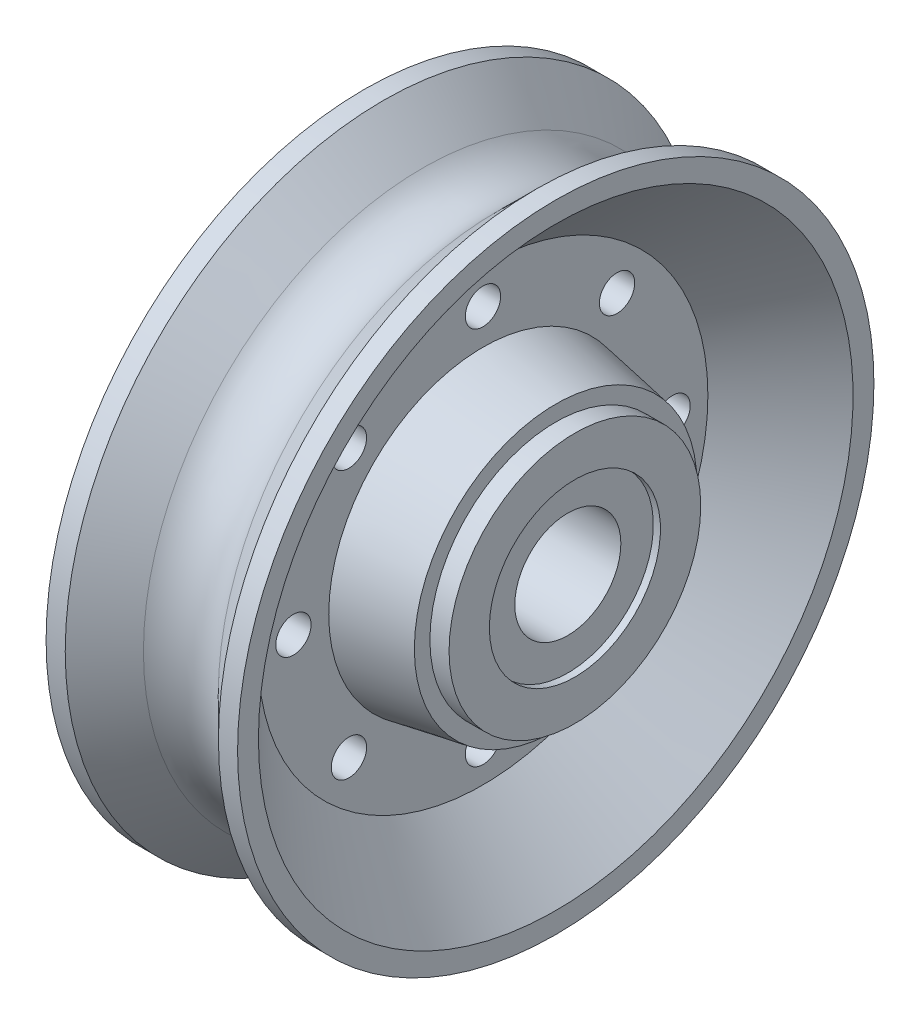
ISO-10303-21;
HEADER;
FILE_DESCRIPTION(('STEP AP214'),'2;1');
FILE_NAME('part.step','',(''),(''),'','','');
FILE_SCHEMA(('AUTOMOTIVE_DESIGN { 1 0 10303 214 1 1 1 1 }'));
ENDSEC;
DATA;
#1=APPLICATION_CONTEXT('core data for automotive mechanical design processes');
#2=APPLICATION_PROTOCOL_DEFINITION('international standard','automotive_design',2000,#1);
#3=PRODUCT_CONTEXT('',#1,'mechanical');
#4=PRODUCT('Part','Part','',(#3));
#5=PRODUCT_RELATED_PRODUCT_CATEGORY('part','',(#4));
#6=PRODUCT_DEFINITION_FORMATION('','',#4);
#7=PRODUCT_DEFINITION_CONTEXT('part definition',#1,'design');
#8=PRODUCT_DEFINITION('design','',#6,#7);
#9=PRODUCT_DEFINITION_SHAPE('','',#8);
#10=(LENGTH_UNIT() NAMED_UNIT(*) SI_UNIT(.MILLI.,.METRE.));
#11=(NAMED_UNIT(*) PLANE_ANGLE_UNIT() SI_UNIT($,.RADIAN.));
#12=(NAMED_UNIT(*) SI_UNIT($,.STERADIAN.) SOLID_ANGLE_UNIT());
#13=UNCERTAINTY_MEASURE_WITH_UNIT(LENGTH_MEASURE(1.E-05),#10,'distance_accuracy_value','');
#14=(GEOMETRIC_REPRESENTATION_CONTEXT(3) GLOBAL_UNCERTAINTY_ASSIGNED_CONTEXT((#13)) GLOBAL_UNIT_ASSIGNED_CONTEXT((#10,
#11,#12)) REPRESENTATION_CONTEXT('',''));
#15=CARTESIAN_POINT('',(0.,0.,0.));
#16=DIRECTION('',(0.,0.,1.));
#17=DIRECTION('',(1.,0.,0.));
#18=AXIS2_PLACEMENT_3D('',#15,#16,#17);
#19=CARTESIAN_POINT('',(-10.31875,0.,0.));
#20=DIRECTION('',(-1.,0.,0.));
#21=DIRECTION('',(0.,0.,1.));
#22=AXIS2_PLACEMENT_3D('',#19,#20,#21);
#23=CYLINDRICAL_SURFACE('',#22,4.7625);
#24=CARTESIAN_POINT('',(-9.68375,0.,0.));
#25=DIRECTION('',(-1.,0.,0.));
#26=DIRECTION('',(0.,0.,1.));
#27=AXIS2_PLACEMENT_3D('',#24,#25,#26);
#28=CIRCLE('',#27,4.7625);
#29=CARTESIAN_POINT('',(-9.68375,0.,4.7625));
#30=VERTEX_POINT('',#29);
#31=EDGE_CURVE('E91',#30,#30,#28,.F.);
#32=ORIENTED_EDGE('',*,*,#31,.F.);
#33=EDGE_LOOP('',(#32));
#34=FACE_BOUND('',#33,.T.);
#35=CARTESIAN_POINT('',(9.68375,0.,0.));
#36=DIRECTION('',(1.,0.,0.));
#37=DIRECTION('',(0.,0.,-1.));
#38=AXIS2_PLACEMENT_3D('',#35,#36,#37);
#39=CIRCLE('',#38,4.7625);
#40=CARTESIAN_POINT('',(9.68375,0.,-4.7625));
#41=VERTEX_POINT('',#40);
#42=EDGE_CURVE('E36',#41,#41,#39,.F.);
#43=ORIENTED_EDGE('',*,*,#42,.F.);
#44=EDGE_LOOP('',(#43));
#45=FACE_BOUND('',#44,.T.);
#46=ADVANCED_FACE('F32',(#34,#45),#23,.F.);
#47=CARTESIAN_POINT('',(10.31875,12.7,0.));
#48=DIRECTION('',(-1.,0.,0.));
#49=DIRECTION('',(0.,0.,1.));
#50=AXIS2_PLACEMENT_3D('',#47,#48,#49);
#51=PLANE('',#50);
#52=CARTESIAN_POINT('',(10.31875,0.,0.));
#53=DIRECTION('',(-1.,0.,0.));
#54=DIRECTION('',(0.,0.,1.));
#55=AXIS2_PLACEMENT_3D('',#52,#53,#54);
#56=CIRCLE('',#55,11.303);
#57=CARTESIAN_POINT('',(10.31875,0.,11.303));
#58=VERTEX_POINT('',#57);
#59=EDGE_CURVE('E294',#58,#58,#56,.T.);
#60=ORIENTED_EDGE('',*,*,#59,.F.);
#61=EDGE_LOOP('',(#60));
#62=FACE_BOUND('',#61,.T.);
#63=CARTESIAN_POINT('',(10.31875,0.,0.));
#64=DIRECTION('',(-1.,0.,0.));
#65=DIRECTION('',(0.,0.,1.));
#66=AXIS2_PLACEMENT_3D('',#63,#64,#65);
#67=CIRCLE('',#66,7.6835);
#68=CARTESIAN_POINT('',(10.31875,0.,7.6835));
#69=VERTEX_POINT('',#68);
#70=EDGE_CURVE('E297',#69,#69,#67,.T.);
#71=ORIENTED_EDGE('',*,*,#70,.T.);
#72=EDGE_LOOP('',(#71));
#73=FACE_BOUND('',#72,.T.);
#74=ADVANCED_FACE('F167',(#62,#73),#51,.F.);
#75=CARTESIAN_POINT('',(-10.31875,4.7625,0.));
#76=DIRECTION('',(1.,0.,0.));
#77=DIRECTION('',(0.,0.,-1.));
#78=AXIS2_PLACEMENT_3D('',#75,#76,#77);
#79=PLANE('',#78);
#80=CARTESIAN_POINT('',(-10.31875,0.,0.));
#81=DIRECTION('',(-1.,0.,0.));
#82=DIRECTION('',(0.,0.,1.));
#83=AXIS2_PLACEMENT_3D('',#80,#81,#82);
#84=CIRCLE('',#83,7.6835);
#85=CARTESIAN_POINT('',(-10.31875,0.,7.6835));
#86=VERTEX_POINT('',#85);
#87=EDGE_CURVE('E101',#86,#86,#84,.T.);
#88=ORIENTED_EDGE('',*,*,#87,.F.);
#89=EDGE_LOOP('',(#88));
#90=FACE_BOUND('',#89,.T.);
#91=CARTESIAN_POINT('',(-10.31875,0.,0.));
#92=DIRECTION('',(-1.,0.,0.));
#93=DIRECTION('',(0.,0.,1.));
#94=AXIS2_PLACEMENT_3D('',#91,#92,#93);
#95=CIRCLE('',#94,11.303);
#96=CARTESIAN_POINT('',(-10.31875,0.,11.303));
#97=VERTEX_POINT('',#96);
#98=EDGE_CURVE('E93',#97,#97,#95,.T.);
#99=ORIENTED_EDGE('',*,*,#98,.T.);
#100=EDGE_LOOP('',(#99));
#101=FACE_BOUND('',#100,.T.);
#102=ADVANCED_FACE('F173',(#90,#101),#79,.F.);
#103=CARTESIAN_POINT('',(8.59895833333333,28.575,0.));
#104=DIRECTION('',(-1.,0.,0.));
#105=DIRECTION('',(0.,0.,1.));
#106=AXIS2_PLACEMENT_3D('',#103,#104,#105);
#107=PLANE('',#106);
#108=CARTESIAN_POINT('',(8.59895833333333,0.,0.));
#109=DIRECTION('',(-1.,0.,0.));
#110=DIRECTION('',(0.,0.,1.));
#111=AXIS2_PLACEMENT_3D('',#108,#109,#110);
#112=CIRCLE('',#111,28.575);
#113=CARTESIAN_POINT('',(8.59895833333333,0.,28.575));
#114=VERTEX_POINT('',#113);
#115=EDGE_CURVE('E145',#114,#114,#112,.T.);
#116=ORIENTED_EDGE('',*,*,#115,.F.);
#117=EDGE_LOOP('',(#116));
#118=FACE_BOUND('',#117,.T.);
#119=CARTESIAN_POINT('',(8.59895833333333,0.,0.));
#120=DIRECTION('',(-1.,0.,0.));
#121=DIRECTION('',(0.,0.,1.));
#122=AXIS2_PLACEMENT_3D('',#119,#120,#121);
#123=CIRCLE('',#122,26.70304692904);
#124=CARTESIAN_POINT('',(8.59895833333333,0.,26.70304692904));
#125=VERTEX_POINT('',#124);
#126=EDGE_CURVE('E54',#125,#125,#123,.F.);
#127=ORIENTED_EDGE('',*,*,#126,.F.);
#128=EDGE_LOOP('',(#127));
#129=FACE_BOUND('',#128,.T.);
#130=ADVANCED_FACE('F181',(#118,#129),#107,.F.);
#131=CARTESIAN_POINT('',(-8.59895833333333,12.7,0.));
#132=DIRECTION('',(1.,0.,0.));
#133=DIRECTION('',(0.,0.,-1.));
#134=AXIS2_PLACEMENT_3D('',#131,#132,#133);
#135=PLANE('',#134);
#136=CARTESIAN_POINT('',(-8.59895833333333,0.,0.));
#137=DIRECTION('',(-1.,0.,0.));
#138=DIRECTION('',(0.,0.,1.));
#139=AXIS2_PLACEMENT_3D('',#136,#137,#138);
#140=CIRCLE('',#139,28.575);
#141=CARTESIAN_POINT('',(-8.59895833333333,0.,28.575));
#142=VERTEX_POINT('',#141);
#143=EDGE_CURVE('E45',#142,#142,#140,.T.);
#144=ORIENTED_EDGE('',*,*,#143,.T.);
#145=EDGE_LOOP('',(#144));
#146=FACE_BOUND('',#145,.T.);
#147=CARTESIAN_POINT('',(-8.59895833333333,0.,0.));
#148=DIRECTION('',(1.,0.,0.));
#149=DIRECTION('',(0.,0.,-1.));
#150=AXIS2_PLACEMENT_3D('',#147,#148,#149);
#151=CIRCLE('',#150,26.70304692904);
#152=CARTESIAN_POINT('',(-8.59895833333333,0.,-26.70304692904));
#153=VERTEX_POINT('',#152);
#154=EDGE_CURVE('E49',#153,#153,#151,.F.);
#155=ORIENTED_EDGE('',*,*,#154,.F.);
#156=EDGE_LOOP('',(#155));
#157=FACE_BOUND('',#156,.T.);
#158=ADVANCED_FACE('F150',(#146,#157),#135,.F.);
#159=CARTESIAN_POINT('',(0.,0.,0.));
#160=DIRECTION('',(-1.,0.,0.));
#161=DIRECTION('',(0.,0.,1.));
#162=AXIS2_PLACEMENT_3D('',#159,#160,#161);
#163=TOROIDAL_SURFACE('',#162,28.448,4.76249999999999);
#164=CARTESIAN_POINT('',(-3.35943665925788,0.,0.));
#165=DIRECTION('',(-1.,0.,0.));
#166=DIRECTION('',(0.,0.,1.));
#167=AXIS2_PLACEMENT_3D('',#164,#165,#166);
#168=CIRCLE('',#167,25.0722642901977);
#169=CARTESIAN_POINT('',(-3.35943665925788,0.,25.0722642901977));
#170=VERTEX_POINT('',#169);
#171=EDGE_CURVE('E10',#170,#170,#168,.T.);
#172=ORIENTED_EDGE('',*,*,#171,.F.);
#173=EDGE_LOOP('',(#172));
#174=FACE_BOUND('',#173,.T.);
#175=CARTESIAN_POINT('',(3.35943665925788,0.,0.));
#176=DIRECTION('',(-1.,0.,0.));
#177=DIRECTION('',(0.,0.,1.));
#178=AXIS2_PLACEMENT_3D('',#175,#176,#177);
#179=CIRCLE('',#178,25.0722642901977);
#180=CARTESIAN_POINT('',(3.35943665925788,0.,25.0722642901977));
#181=VERTEX_POINT('',#180);
#182=EDGE_CURVE('E52',#181,#181,#179,.T.);
#183=ORIENTED_EDGE('',*,*,#182,.T.);
#184=EDGE_LOOP('',(#183));
#185=FACE_BOUND('',#184,.T.);
#186=ADVANCED_FACE('F34',(#174,#185),#163,.F.);
#187=CARTESIAN_POINT('',(-3.35943665925788,0.,0.));
#188=DIRECTION('',(-1.,0.,0.));
#189=DIRECTION('',(0.,0.,1.));
#190=AXIS2_PLACEMENT_3D('',#187,#188,#189);
#191=CONICAL_SURFACE('',#190,25.0722642901977,0.782978178008253);
#192=CARTESIAN_POINT('',(-6.87916666666667,0.,0.));
#193=DIRECTION('',(-1.,0.,0.));
#194=DIRECTION('',(0.,0.,1.));
#195=AXIS2_PLACEMENT_3D('',#192,#193,#194);
#196=CIRCLE('',#195,28.575);
#197=CARTESIAN_POINT('',(-6.87916666666667,0.,28.575));
#198=VERTEX_POINT('',#197);
#199=EDGE_CURVE('E40',#198,#198,#196,.T.);
#200=ORIENTED_EDGE('',*,*,#199,.F.);
#201=EDGE_LOOP('',(#200));
#202=FACE_BOUND('',#201,.T.);
#203=ORIENTED_EDGE('',*,*,#171,.T.);
#204=EDGE_LOOP('',(#203));
#205=FACE_BOUND('',#204,.T.);
#206=ADVANCED_FACE('F157',(#202,#205),#191,.T.);
#207=CARTESIAN_POINT('',(-10.31875,0.,0.));
#208=DIRECTION('',(-1.,0.,0.));
#209=DIRECTION('',(0.,0.,1.));
#210=AXIS2_PLACEMENT_3D('',#207,#208,#209);
#211=CYLINDRICAL_SURFACE('',#210,28.575);
#212=ORIENTED_EDGE('',*,*,#143,.F.);
#213=EDGE_LOOP('',(#212));
#214=FACE_BOUND('',#213,.T.);
#215=ORIENTED_EDGE('',*,*,#199,.T.);
#216=EDGE_LOOP('',(#215));
#217=FACE_BOUND('',#216,.T.);
#218=ADVANCED_FACE('F153',(#214,#217),#211,.T.);
#219=CARTESIAN_POINT('',(-10.31875,0.,0.));
#220=DIRECTION('',(-1.,0.,0.));
#221=DIRECTION('',(0.,0.,1.));
#222=AXIS2_PLACEMENT_3D('',#219,#220,#221);
#223=CYLINDRICAL_SURFACE('',#222,28.575);
#224=CARTESIAN_POINT('',(6.87916666666667,0.,0.));
#225=DIRECTION('',(-1.,0.,0.));
#226=DIRECTION('',(0.,0.,1.));
#227=AXIS2_PLACEMENT_3D('',#224,#225,#226);
#228=CIRCLE('',#227,28.575);
#229=CARTESIAN_POINT('',(6.87916666666667,0.,28.575));
#230=VERTEX_POINT('',#229);
#231=EDGE_CURVE('E142',#230,#230,#228,.T.);
#232=ORIENTED_EDGE('',*,*,#231,.F.);
#233=EDGE_LOOP('',(#232));
#234=FACE_BOUND('',#233,.T.);
#235=ORIENTED_EDGE('',*,*,#115,.T.);
#236=EDGE_LOOP('',(#235));
#237=FACE_BOUND('',#236,.T.);
#238=ADVANCED_FACE('F156',(#234,#237),#223,.T.);
#239=CARTESIAN_POINT('',(6.87916666666667,0.,0.));
#240=DIRECTION('',(1.,0.,0.));
#241=DIRECTION('',(0.,0.,-1.));
#242=AXIS2_PLACEMENT_3D('',#239,#240,#241);
#243=CONICAL_SURFACE('',#242,28.575,0.782978178008253);
#244=ORIENTED_EDGE('',*,*,#182,.F.);
#245=EDGE_LOOP('',(#244));
#246=FACE_BOUND('',#245,.T.);
#247=ORIENTED_EDGE('',*,*,#231,.T.);
#248=EDGE_LOOP('',(#247));
#249=FACE_BOUND('',#248,.T.);
#250=ADVANCED_FACE('F195',(#246,#249),#243,.T.);
#251=CARTESIAN_POINT('',(-2.06375,0.,0.));
#252=DIRECTION('',(-1.,0.,0.));
#253=DIRECTION('',(0.,0.,1.));
#254=AXIS2_PLACEMENT_3D('',#251,#252,#253);
#255=CONICAL_SURFACE('',#254,20.1993925146446,0.782978178008253);
#256=CARTESIAN_POINT('',(-2.06375,0.,0.));
#257=DIRECTION('',(-1.,0.,0.));
#258=DIRECTION('',(0.,0.,1.));
#259=AXIS2_PLACEMENT_3D('',#256,#257,#258);
#260=CIRCLE('',#259,20.1993925146446);
#261=CARTESIAN_POINT('',(-2.06375,0.,20.1993925146446));
#262=VERTEX_POINT('',#261);
#263=EDGE_CURVE('E53',#262,#262,#260,.T.);
#264=ORIENTED_EDGE('',*,*,#263,.F.);
#265=EDGE_LOOP('',(#264));
#266=FACE_BOUND('',#265,.T.);
#267=ORIENTED_EDGE('',*,*,#154,.T.);
#268=EDGE_LOOP('',(#267));
#269=FACE_BOUND('',#268,.T.);
#270=ADVANCED_FACE('F199',(#266,#269),#255,.F.);
#271=CARTESIAN_POINT('',(-2.06375,13.8523335537175,0.));
#272=DIRECTION('',(-1.,0.,0.));
#273=DIRECTION('',(0.,0.,1.));
#274=AXIS2_PLACEMENT_3D('',#271,#272,#273);
#275=PLANE('',#274);
#276=CARTESIAN_POINT('',(-2.06375,12.0391032070229,12.0391032070226));
#277=DIRECTION('',(-1.,0.,0.));
#278=DIRECTION('',(0.,0.,1.));
#279=AXIS2_PLACEMENT_3D('',#276,#277,#278);
#280=CIRCLE('',#279,1.58676474023178);
#281=CARTESIAN_POINT('',(-2.06375,12.0391032070229,13.6258679472544));
#282=VERTEX_POINT('',#281);
#283=EDGE_CURVE('E87',#282,#282,#280,.T.);
#284=ORIENTED_EDGE('',*,*,#283,.F.);
#285=EDGE_LOOP('',(#284));
#286=FACE_BOUND('',#285,.T.);
#287=CARTESIAN_POINT('',(-2.06375,1.80686858843117E-13,17.025863034181));
#288=DIRECTION('',(-1.,0.,0.));
#289=DIRECTION('',(0.,0.,1.));
#290=AXIS2_PLACEMENT_3D('',#287,#288,#289);
#291=CIRCLE('',#290,1.58676474023178);
#292=CARTESIAN_POINT('',(-2.06375,1.80686858843117E-13,18.6126277744128));
#293=VERTEX_POINT('',#292);
#294=EDGE_CURVE('E83',#293,#293,#291,.T.);
#295=ORIENTED_EDGE('',*,*,#294,.F.);
#296=EDGE_LOOP('',(#295));
#297=FACE_BOUND('',#296,.T.);
#298=CARTESIAN_POINT('',(-2.06375,-12.0391032070227,12.0391032070229));
#299=DIRECTION('',(-1.,0.,0.));
#300=DIRECTION('',(0.,0.,1.));
#301=AXIS2_PLACEMENT_3D('',#298,#299,#300);
#302=CIRCLE('',#301,1.58676474023178);
#303=CARTESIAN_POINT('',(-2.06375,-12.0391032070227,13.6258679472547));
#304=VERTEX_POINT('',#303);
#305=EDGE_CURVE('E79',#304,#304,#302,.T.);
#306=ORIENTED_EDGE('',*,*,#305,.F.);
#307=EDGE_LOOP('',(#306));
#308=FACE_BOUND('',#307,.T.);
#309=CARTESIAN_POINT('',(-2.06375,-17.025863034181,0.));
#310=DIRECTION('',(-1.,0.,0.));
#311=DIRECTION('',(0.,0.,1.));
#312=AXIS2_PLACEMENT_3D('',#309,#310,#311);
#313=CIRCLE('',#312,1.58676474023178);
#314=CARTESIAN_POINT('',(-2.06375,-17.025863034181,1.58676474023178));
#315=VERTEX_POINT('',#314);
#316=EDGE_CURVE('E75',#315,#315,#313,.T.);
#317=ORIENTED_EDGE('',*,*,#316,.F.);
#318=EDGE_LOOP('',(#317));
#319=FACE_BOUND('',#318,.T.);
#320=CARTESIAN_POINT('',(-2.06375,-12.0391032070228,-12.0391032070227));
#321=DIRECTION('',(-1.,0.,0.));
#322=DIRECTION('',(0.,0.,1.));
#323=AXIS2_PLACEMENT_3D('',#320,#321,#322);
#324=CIRCLE('',#323,1.58676474023178);
#325=CARTESIAN_POINT('',(-2.06375,-12.0391032070228,-10.4523384667909));
#326=VERTEX_POINT('',#325);
#327=EDGE_CURVE('E71',#326,#326,#324,.T.);
#328=ORIENTED_EDGE('',*,*,#327,.F.);
#329=EDGE_LOOP('',(#328));
#330=FACE_BOUND('',#329,.T.);
#331=CARTESIAN_POINT('',(-2.06375,0.,-17.025863034181));
#332=DIRECTION('',(-1.,0.,0.));
#333=DIRECTION('',(0.,0.,1.));
#334=AXIS2_PLACEMENT_3D('',#331,#332,#333);
#335=CIRCLE('',#334,1.58676474023178);
#336=CARTESIAN_POINT('',(-2.06375,0.,-15.4390982939493));
#337=VERTEX_POINT('',#336);
#338=EDGE_CURVE('E67',#337,#337,#335,.T.);
#339=ORIENTED_EDGE('',*,*,#338,.F.);
#340=EDGE_LOOP('',(#339));
#341=FACE_BOUND('',#340,.T.);
#342=CARTESIAN_POINT('',(-2.06375,12.0391032070228,-12.0391032070228));
#343=DIRECTION('',(-1.,0.,0.));
#344=DIRECTION('',(0.,0.,1.));
#345=AXIS2_PLACEMENT_3D('',#342,#343,#344);
#346=CIRCLE('',#345,1.58676474023178);
#347=CARTESIAN_POINT('',(-2.06375,12.0391032070228,-10.452338466791));
#348=VERTEX_POINT('',#347);
#349=EDGE_CURVE('E63',#348,#348,#346,.T.);
#350=ORIENTED_EDGE('',*,*,#349,.F.);
#351=EDGE_LOOP('',(#350));
#352=FACE_BOUND('',#351,.T.);
#353=CARTESIAN_POINT('',(-2.06375,17.025863034181,0.));
#354=DIRECTION('',(-1.,0.,0.));
#355=DIRECTION('',(0.,0.,1.));
#356=AXIS2_PLACEMENT_3D('',#353,#354,#355);
#357=CIRCLE('',#356,1.58676474023178);
#358=CARTESIAN_POINT('',(-2.06375,17.025863034181,1.58676474023178));
#359=VERTEX_POINT('',#358);
#360=EDGE_CURVE('E62',#359,#359,#357,.T.);
#361=ORIENTED_EDGE('',*,*,#360,.F.);
#362=EDGE_LOOP('',(#361));
#363=FACE_BOUND('',#362,.T.);
#364=ORIENTED_EDGE('',*,*,#263,.T.);
#365=EDGE_LOOP('',(#364));
#366=FACE_BOUND('',#365,.T.);
#367=CARTESIAN_POINT('',(-2.06375,0.,0.));
#368=DIRECTION('',(-1.,0.,0.));
#369=DIRECTION('',(0.,0.,1.));
#370=AXIS2_PLACEMENT_3D('',#367,#368,#369);
#371=CIRCLE('',#370,13.8523335537175);
#372=CARTESIAN_POINT('',(-2.06375,0.,13.8523335537175));
#373=VERTEX_POINT('',#372);
#374=EDGE_CURVE('E57',#373,#373,#371,.T.);
#375=ORIENTED_EDGE('',*,*,#374,.F.);
#376=EDGE_LOOP('',(#375));
#377=FACE_BOUND('',#376,.T.);
#378=ADVANCED_FACE('F203',(#286,#297,#308,#319,#330,#341,#352,#363,#366,#377),#275,.T.);
#379=CARTESIAN_POINT('',(-8.59895833333333,0.,0.));
#380=DIRECTION('',(1.,0.,0.));
#381=DIRECTION('',(0.,0.,-1.));
#382=AXIS2_PLACEMENT_3D('',#379,#380,#381);
#383=CONICAL_SURFACE('',#382,12.7,0.174532925199434);
#384=ORIENTED_EDGE('',*,*,#374,.T.);
#385=EDGE_LOOP('',(#384));
#386=FACE_BOUND('',#385,.T.);
#387=CARTESIAN_POINT('',(-8.59895833333334,0.,0.));
#388=DIRECTION('',(-1.,0.,0.));
#389=DIRECTION('',(0.,0.,1.));
#390=AXIS2_PLACEMENT_3D('',#387,#388,#389);
#391=CIRCLE('',#390,12.7);
#392=CARTESIAN_POINT('',(-8.59895833333334,0.,12.7));
#393=VERTEX_POINT('',#392);
#394=EDGE_CURVE('E90',#393,#393,#391,.F.);
#395=ORIENTED_EDGE('',*,*,#394,.T.);
#396=EDGE_LOOP('',(#395));
#397=FACE_BOUND('',#396,.T.);
#398=ADVANCED_FACE('F207',(#386,#397),#383,.T.);
#399=CARTESIAN_POINT('',(10.31875,0.,0.));
#400=DIRECTION('',(1.,0.,0.));
#401=DIRECTION('',(0.,0.,-1.));
#402=AXIS2_PLACEMENT_3D('',#399,#400,#401);
#403=CONICAL_SURFACE('',#402,28.4145349328282,0.782978178008253);
#404=CARTESIAN_POINT('',(2.06375,0.,0.));
#405=DIRECTION('',(-1.,0.,0.));
#406=DIRECTION('',(0.,0.,1.));
#407=AXIS2_PLACEMENT_3D('',#404,#405,#406);
#408=CIRCLE('',#407,20.1993925146446);
#409=CARTESIAN_POINT('',(2.06375,0.,20.1993925146446));
#410=VERTEX_POINT('',#409);
#411=EDGE_CURVE('E131',#410,#410,#408,.T.);
#412=ORIENTED_EDGE('',*,*,#411,.T.);
#413=EDGE_LOOP('',(#412));
#414=FACE_BOUND('',#413,.T.);
#415=ORIENTED_EDGE('',*,*,#126,.T.);
#416=EDGE_LOOP('',(#415));
#417=FACE_BOUND('',#416,.T.);
#418=ADVANCED_FACE('F211',(#414,#417),#403,.F.);
#419=CARTESIAN_POINT('',(2.06375,0.,0.));
#420=DIRECTION('',(-1.,0.,0.));
#421=DIRECTION('',(0.,0.,1.));
#422=AXIS2_PLACEMENT_3D('',#419,#420,#421);
#423=CONICAL_SURFACE('',#422,13.8523335537175,0.174532925199434);
#424=CARTESIAN_POINT('',(8.59895833333334,0.,0.));
#425=DIRECTION('',(1.,0.,0.));
#426=DIRECTION('',(0.,0.,-1.));
#427=AXIS2_PLACEMENT_3D('',#424,#425,#426);
#428=CIRCLE('',#427,12.7);
#429=CARTESIAN_POINT('',(8.59895833333334,0.,-12.7));
#430=VERTEX_POINT('',#429);
#431=EDGE_CURVE('E106',#430,#430,#428,.F.);
#432=ORIENTED_EDGE('',*,*,#431,.T.);
#433=EDGE_LOOP('',(#432));
#434=FACE_BOUND('',#433,.T.);
#435=CARTESIAN_POINT('',(2.06375,0.,0.));
#436=DIRECTION('',(-1.,0.,0.));
#437=DIRECTION('',(0.,0.,1.));
#438=AXIS2_PLACEMENT_3D('',#435,#436,#437);
#439=CIRCLE('',#438,13.8523335537175);
#440=CARTESIAN_POINT('',(2.06375,0.,13.8523335537175));
#441=VERTEX_POINT('',#440);
#442=EDGE_CURVE('E58',#441,#441,#439,.T.);
#443=ORIENTED_EDGE('',*,*,#442,.F.);
#444=EDGE_LOOP('',(#443));
#445=FACE_BOUND('',#444,.T.);
#446=ADVANCED_FACE('F213',(#434,#445),#423,.T.);
#447=CARTESIAN_POINT('',(2.06375,13.8523335537175,0.));
#448=DIRECTION('',(1.,0.,0.));
#449=DIRECTION('',(0.,0.,-1.));
#450=AXIS2_PLACEMENT_3D('',#447,#448,#449);
#451=PLANE('',#450);
#452=CARTESIAN_POINT('',(2.06375,12.0391032070229,12.0391032070226));
#453=DIRECTION('',(1.,0.,0.));
#454=DIRECTION('',(0.,0.,-1.));
#455=AXIS2_PLACEMENT_3D('',#452,#453,#454);
#456=CIRCLE('',#455,1.58676474023178);
#457=CARTESIAN_POINT('',(2.06375,12.0391032070229,10.4523384667908));
#458=VERTEX_POINT('',#457);
#459=EDGE_CURVE('E88',#458,#458,#456,.T.);
#460=ORIENTED_EDGE('',*,*,#459,.F.);
#461=EDGE_LOOP('',(#460));
#462=FACE_BOUND('',#461,.T.);
#463=CARTESIAN_POINT('',(2.06375,1.80686858843117E-13,17.025863034181));
#464=DIRECTION('',(1.,0.,0.));
#465=DIRECTION('',(0.,0.,-1.));
#466=AXIS2_PLACEMENT_3D('',#463,#464,#465);
#467=CIRCLE('',#466,1.58676474023178);
#468=CARTESIAN_POINT('',(2.06375,1.80686858843117E-13,15.4390982939493));
#469=VERTEX_POINT('',#468);
#470=EDGE_CURVE('E84',#469,#469,#467,.T.);
#471=ORIENTED_EDGE('',*,*,#470,.F.);
#472=EDGE_LOOP('',(#471));
#473=FACE_BOUND('',#472,.T.);
#474=CARTESIAN_POINT('',(2.06375,-12.0391032070227,12.0391032070229));
#475=DIRECTION('',(1.,0.,0.));
#476=DIRECTION('',(0.,0.,-1.));
#477=AXIS2_PLACEMENT_3D('',#474,#475,#476);
#478=CIRCLE('',#477,1.58676474023178);
#479=CARTESIAN_POINT('',(2.06375,-12.0391032070227,10.4523384667911));
#480=VERTEX_POINT('',#479);
#481=EDGE_CURVE('E80',#480,#480,#478,.T.);
#482=ORIENTED_EDGE('',*,*,#481,.F.);
#483=EDGE_LOOP('',(#482));
#484=FACE_BOUND('',#483,.T.);
#485=CARTESIAN_POINT('',(2.06375,-17.025863034181,0.));
#486=DIRECTION('',(1.,0.,0.));
#487=DIRECTION('',(0.,0.,-1.));
#488=AXIS2_PLACEMENT_3D('',#485,#486,#487);
#489=CIRCLE('',#488,1.58676474023178);
#490=CARTESIAN_POINT('',(2.06375,-17.025863034181,-1.58676474023178));
#491=VERTEX_POINT('',#490);
#492=EDGE_CURVE('E76',#491,#491,#489,.T.);
#493=ORIENTED_EDGE('',*,*,#492,.F.);
#494=EDGE_LOOP('',(#493));
#495=FACE_BOUND('',#494,.T.);
#496=CARTESIAN_POINT('',(2.06375,-12.0391032070228,-12.0391032070227));
#497=DIRECTION('',(1.,0.,0.));
#498=DIRECTION('',(0.,0.,-1.));
#499=AXIS2_PLACEMENT_3D('',#496,#497,#498);
#500=CIRCLE('',#499,1.58676474023178);
#501=CARTESIAN_POINT('',(2.06375,-12.0391032070228,-13.6258679472545));
#502=VERTEX_POINT('',#501);
#503=EDGE_CURVE('E72',#502,#502,#500,.T.);
#504=ORIENTED_EDGE('',*,*,#503,.F.);
#505=EDGE_LOOP('',(#504));
#506=FACE_BOUND('',#505,.T.);
#507=CARTESIAN_POINT('',(2.06375,0.,-17.025863034181));
#508=DIRECTION('',(1.,0.,0.));
#509=DIRECTION('',(0.,0.,-1.));
#510=AXIS2_PLACEMENT_3D('',#507,#508,#509);
#511=CIRCLE('',#510,1.58676474023178);
#512=CARTESIAN_POINT('',(2.06375,0.,-18.6126277744128));
#513=VERTEX_POINT('',#512);
#514=EDGE_CURVE('E68',#513,#513,#511,.T.);
#515=ORIENTED_EDGE('',*,*,#514,.F.);
#516=EDGE_LOOP('',(#515));
#517=FACE_BOUND('',#516,.T.);
#518=CARTESIAN_POINT('',(2.06375,12.0391032070228,-12.0391032070228));
#519=DIRECTION('',(1.,0.,0.));
#520=DIRECTION('',(0.,0.,-1.));
#521=AXIS2_PLACEMENT_3D('',#518,#519,#520);
#522=CIRCLE('',#521,1.58676474023178);
#523=CARTESIAN_POINT('',(2.06375,12.0391032070228,-13.6258679472546));
#524=VERTEX_POINT('',#523);
#525=EDGE_CURVE('E64',#524,#524,#522,.T.);
#526=ORIENTED_EDGE('',*,*,#525,.F.);
#527=EDGE_LOOP('',(#526));
#528=FACE_BOUND('',#527,.T.);
#529=CARTESIAN_POINT('',(2.06375,17.025863034181,0.));
#530=DIRECTION('',(1.,0.,0.));
#531=DIRECTION('',(0.,0.,-1.));
#532=AXIS2_PLACEMENT_3D('',#529,#530,#531);
#533=CIRCLE('',#532,1.58676474023178);
#534=CARTESIAN_POINT('',(2.06375,17.025863034181,-1.58676474023178));
#535=VERTEX_POINT('',#534);
#536=EDGE_CURVE('E59',#535,#535,#533,.T.);
#537=ORIENTED_EDGE('',*,*,#536,.F.);
#538=EDGE_LOOP('',(#537));
#539=FACE_BOUND('',#538,.T.);
#540=ORIENTED_EDGE('',*,*,#442,.T.);
#541=EDGE_LOOP('',(#540));
#542=FACE_BOUND('',#541,.T.);
#543=ORIENTED_EDGE('',*,*,#411,.F.);
#544=EDGE_LOOP('',(#543));
#545=FACE_BOUND('',#544,.T.);
#546=ADVANCED_FACE('F216',(#462,#473,#484,#495,#506,#517,#528,#539,#542,#545),#451,.T.);
#547=CARTESIAN_POINT('',(-10.31875,17.025863034181,0.));
#548=DIRECTION('',(1.,0.,0.));
#549=DIRECTION('',(0.,0.,-1.));
#550=AXIS2_PLACEMENT_3D('',#547,#548,#549);
#551=CYLINDRICAL_SURFACE('',#550,1.58676474023178);
#552=ORIENTED_EDGE('',*,*,#360,.T.);
#553=EDGE_LOOP('',(#552));
#554=FACE_BOUND('',#553,.T.);
#555=ORIENTED_EDGE('',*,*,#536,.T.);
#556=EDGE_LOOP('',(#555));
#557=FACE_BOUND('',#556,.T.);
#558=ADVANCED_FACE('F220',(#554,#557),#551,.F.);
#559=CARTESIAN_POINT('',(-10.31875,12.0391032070228,-12.0391032070228));
#560=DIRECTION('',(1.,0.,0.));
#561=DIRECTION('',(0.,0.,-1.));
#562=AXIS2_PLACEMENT_3D('',#559,#560,#561);
#563=CYLINDRICAL_SURFACE('',#562,1.58676474023178);
#564=ORIENTED_EDGE('',*,*,#349,.T.);
#565=EDGE_LOOP('',(#564));
#566=FACE_BOUND('',#565,.T.);
#567=ORIENTED_EDGE('',*,*,#525,.T.);
#568=EDGE_LOOP('',(#567));
#569=FACE_BOUND('',#568,.T.);
#570=ADVANCED_FACE('F227',(#566,#569),#563,.F.);
#571=CARTESIAN_POINT('',(-10.31875,0.,-17.025863034181));
#572=DIRECTION('',(1.,0.,0.));
#573=DIRECTION('',(0.,0.,-1.));
#574=AXIS2_PLACEMENT_3D('',#571,#572,#573);
#575=CYLINDRICAL_SURFACE('',#574,1.58676474023178);
#576=ORIENTED_EDGE('',*,*,#338,.T.);
#577=EDGE_LOOP('',(#576));
#578=FACE_BOUND('',#577,.T.);
#579=ORIENTED_EDGE('',*,*,#514,.T.);
#580=EDGE_LOOP('',(#579));
#581=FACE_BOUND('',#580,.T.);
#582=ADVANCED_FACE('F231',(#578,#581),#575,.F.);
#583=CARTESIAN_POINT('',(-10.31875,-12.0391032070228,-12.0391032070227));
#584=DIRECTION('',(1.,0.,0.));
#585=DIRECTION('',(0.,0.,-1.));
#586=AXIS2_PLACEMENT_3D('',#583,#584,#585);
#587=CYLINDRICAL_SURFACE('',#586,1.58676474023178);
#588=ORIENTED_EDGE('',*,*,#327,.T.);
#589=EDGE_LOOP('',(#588));
#590=FACE_BOUND('',#589,.T.);
#591=ORIENTED_EDGE('',*,*,#503,.T.);
#592=EDGE_LOOP('',(#591));
#593=FACE_BOUND('',#592,.T.);
#594=ADVANCED_FACE('F235',(#590,#593),#587,.F.);
#595=CARTESIAN_POINT('',(-10.31875,-17.025863034181,0.));
#596=DIRECTION('',(1.,0.,0.));
#597=DIRECTION('',(0.,0.,-1.));
#598=AXIS2_PLACEMENT_3D('',#595,#596,#597);
#599=CYLINDRICAL_SURFACE('',#598,1.58676474023178);
#600=ORIENTED_EDGE('',*,*,#316,.T.);
#601=EDGE_LOOP('',(#600));
#602=FACE_BOUND('',#601,.T.);
#603=ORIENTED_EDGE('',*,*,#492,.T.);
#604=EDGE_LOOP('',(#603));
#605=FACE_BOUND('',#604,.T.);
#606=ADVANCED_FACE('F239',(#602,#605),#599,.F.);
#607=CARTESIAN_POINT('',(-10.31875,-12.0391032070227,12.0391032070229));
#608=DIRECTION('',(1.,0.,0.));
#609=DIRECTION('',(0.,0.,-1.));
#610=AXIS2_PLACEMENT_3D('',#607,#608,#609);
#611=CYLINDRICAL_SURFACE('',#610,1.58676474023178);
#612=ORIENTED_EDGE('',*,*,#305,.T.);
#613=EDGE_LOOP('',(#612));
#614=FACE_BOUND('',#613,.T.);
#615=ORIENTED_EDGE('',*,*,#481,.T.);
#616=EDGE_LOOP('',(#615));
#617=FACE_BOUND('',#616,.T.);
#618=ADVANCED_FACE('F243',(#614,#617),#611,.F.);
#619=CARTESIAN_POINT('',(-10.31875,1.80686858843117E-13,17.025863034181));
#620=DIRECTION('',(1.,0.,0.));
#621=DIRECTION('',(0.,0.,-1.));
#622=AXIS2_PLACEMENT_3D('',#619,#620,#621);
#623=CYLINDRICAL_SURFACE('',#622,1.58676474023178);
#624=ORIENTED_EDGE('',*,*,#294,.T.);
#625=EDGE_LOOP('',(#624));
#626=FACE_BOUND('',#625,.T.);
#627=ORIENTED_EDGE('',*,*,#470,.T.);
#628=EDGE_LOOP('',(#627));
#629=FACE_BOUND('',#628,.T.);
#630=ADVANCED_FACE('F247',(#626,#629),#623,.F.);
#631=CARTESIAN_POINT('',(-10.31875,12.0391032070229,12.0391032070226));
#632=DIRECTION('',(1.,0.,0.));
#633=DIRECTION('',(0.,0.,-1.));
#634=AXIS2_PLACEMENT_3D('',#631,#632,#633);
#635=CYLINDRICAL_SURFACE('',#634,1.58676474023178);
#636=ORIENTED_EDGE('',*,*,#283,.T.);
#637=EDGE_LOOP('',(#636));
#638=FACE_BOUND('',#637,.T.);
#639=ORIENTED_EDGE('',*,*,#459,.T.);
#640=EDGE_LOOP('',(#639));
#641=FACE_BOUND('',#640,.T.);
#642=ADVANCED_FACE('F251',(#638,#641),#635,.F.);
#643=CARTESIAN_POINT('',(-8.59895833333334,0.,0.));
#644=DIRECTION('',(-1.,0.,0.));
#645=DIRECTION('',(0.,0.,1.));
#646=AXIS2_PLACEMENT_3D('',#643,#644,#645);
#647=PLANE('',#646);
#648=ORIENTED_EDGE('',*,*,#394,.F.);
#649=EDGE_LOOP('',(#648));
#650=FACE_BOUND('',#649,.T.);
#651=CARTESIAN_POINT('',(-8.59895833333334,0.,0.));
#652=DIRECTION('',(-1.,0.,0.));
#653=DIRECTION('',(0.,0.,1.));
#654=AXIS2_PLACEMENT_3D('',#651,#652,#653);
#655=CIRCLE('',#654,11.303);
#656=CARTESIAN_POINT('',(-8.59895833333334,0.,11.303));
#657=VERTEX_POINT('',#656);
#658=EDGE_CURVE('E98',#657,#657,#655,.T.);
#659=ORIENTED_EDGE('',*,*,#658,.F.);
#660=EDGE_LOOP('',(#659));
#661=FACE_BOUND('',#660,.T.);
#662=ADVANCED_FACE('F255',(#650,#661),#647,.T.);
#663=CARTESIAN_POINT('',(-8.59895833333334,0.,0.));
#664=DIRECTION('',(-1.,0.,0.));
#665=DIRECTION('',(0.,0.,1.));
#666=AXIS2_PLACEMENT_3D('',#663,#664,#665);
#667=CYLINDRICAL_SURFACE('',#666,11.303);
#668=ORIENTED_EDGE('',*,*,#658,.T.);
#669=EDGE_LOOP('',(#668));
#670=FACE_BOUND('',#669,.T.);
#671=ORIENTED_EDGE('',*,*,#98,.F.);
#672=EDGE_LOOP('',(#671));
#673=FACE_BOUND('',#672,.T.);
#674=ADVANCED_FACE('F259',(#670,#673),#667,.T.);
#675=CARTESIAN_POINT('',(-9.68375,0.,0.));
#676=DIRECTION('',(-1.,0.,0.));
#677=DIRECTION('',(0.,0.,1.));
#678=AXIS2_PLACEMENT_3D('',#675,#676,#677);
#679=PLANE('',#678);
#680=CARTESIAN_POINT('',(-9.68375,0.,0.));
#681=DIRECTION('',(-1.,0.,0.));
#682=DIRECTION('',(0.,0.,1.));
#683=AXIS2_PLACEMENT_3D('',#680,#681,#682);
#684=CIRCLE('',#683,7.6835);
#685=CARTESIAN_POINT('',(-9.68375,0.,7.6835));
#686=VERTEX_POINT('',#685);
#687=EDGE_CURVE('E94',#686,#686,#684,.T.);
#688=ORIENTED_EDGE('',*,*,#687,.T.);
#689=EDGE_LOOP('',(#688));
#690=FACE_BOUND('',#689,.T.);
#691=ORIENTED_EDGE('',*,*,#31,.T.);
#692=EDGE_LOOP('',(#691));
#693=FACE_BOUND('',#692,.T.);
#694=ADVANCED_FACE('F263',(#690,#693),#679,.T.);
#695=CARTESIAN_POINT('',(-9.68375,0.,0.));
#696=DIRECTION('',(-1.,0.,0.));
#697=DIRECTION('',(0.,0.,1.));
#698=AXIS2_PLACEMENT_3D('',#695,#696,#697);
#699=CYLINDRICAL_SURFACE('',#698,7.6835);
#700=ORIENTED_EDGE('',*,*,#687,.F.);
#701=EDGE_LOOP('',(#700));
#702=FACE_BOUND('',#701,.T.);
#703=ORIENTED_EDGE('',*,*,#87,.T.);
#704=EDGE_LOOP('',(#703));
#705=FACE_BOUND('',#704,.T.);
#706=ADVANCED_FACE('F265',(#702,#705),#699,.F.);
#707=CARTESIAN_POINT('',(8.59895833333334,0.,0.));
#708=DIRECTION('',(1.,0.,0.));
#709=DIRECTION('',(0.,0.,1.));
#710=AXIS2_PLACEMENT_3D('',#707,#708,#709);
#711=PLANE('',#710);
#712=ORIENTED_EDGE('',*,*,#431,.F.);
#713=EDGE_LOOP('',(#712));
#714=FACE_BOUND('',#713,.T.);
#715=CARTESIAN_POINT('',(8.59895833333334,0.,0.));
#716=DIRECTION('',(-1.,0.,0.));
#717=DIRECTION('',(0.,0.,1.));
#718=AXIS2_PLACEMENT_3D('',#715,#716,#717);
#719=CIRCLE('',#718,11.303);
#720=CARTESIAN_POINT('',(8.59895833333334,0.,11.303));
#721=VERTEX_POINT('',#720);
#722=EDGE_CURVE('E296',#721,#721,#719,.T.);
#723=ORIENTED_EDGE('',*,*,#722,.T.);
#724=EDGE_LOOP('',(#723));
#725=FACE_BOUND('',#724,.T.);
#726=ADVANCED_FACE('F268',(#714,#725),#711,.T.);
#727=CARTESIAN_POINT('',(8.59895833333334,0.,0.));
#728=DIRECTION('',(1.,0.,0.));
#729=DIRECTION('',(0.,0.,-1.));
#730=AXIS2_PLACEMENT_3D('',#727,#728,#729);
#731=CYLINDRICAL_SURFACE('',#730,11.303);
#732=ORIENTED_EDGE('',*,*,#722,.F.);
#733=EDGE_LOOP('',(#732));
#734=FACE_BOUND('',#733,.T.);
#735=ORIENTED_EDGE('',*,*,#59,.T.);
#736=EDGE_LOOP('',(#735));
#737=FACE_BOUND('',#736,.T.);
#738=ADVANCED_FACE('F274',(#734,#737),#731,.T.);
#739=CARTESIAN_POINT('',(9.68375,0.,0.));
#740=DIRECTION('',(1.,0.,0.));
#741=DIRECTION('',(0.,0.,1.));
#742=AXIS2_PLACEMENT_3D('',#739,#740,#741);
#743=PLANE('',#742);
#744=CARTESIAN_POINT('',(9.68375,0.,0.));
#745=DIRECTION('',(-1.,0.,0.));
#746=DIRECTION('',(0.,0.,1.));
#747=AXIS2_PLACEMENT_3D('',#744,#745,#746);
#748=CIRCLE('',#747,7.6835);
#749=CARTESIAN_POINT('',(9.68375,0.,7.6835));
#750=VERTEX_POINT('',#749);
#751=EDGE_CURVE('E291',#750,#750,#748,.T.);
#752=ORIENTED_EDGE('',*,*,#751,.F.);
#753=EDGE_LOOP('',(#752));
#754=FACE_BOUND('',#753,.T.);
#755=ORIENTED_EDGE('',*,*,#42,.T.);
#756=EDGE_LOOP('',(#755));
#757=FACE_BOUND('',#756,.T.);
#758=ADVANCED_FACE('F278',(#754,#757),#743,.T.);
#759=CARTESIAN_POINT('',(9.68375,0.,0.));
#760=DIRECTION('',(1.,0.,0.));
#761=DIRECTION('',(0.,0.,-1.));
#762=AXIS2_PLACEMENT_3D('',#759,#760,#761);
#763=CYLINDRICAL_SURFACE('',#762,7.6835);
#764=ORIENTED_EDGE('',*,*,#751,.T.);
#765=EDGE_LOOP('',(#764));
#766=FACE_BOUND('',#765,.T.);
#767=ORIENTED_EDGE('',*,*,#70,.F.);
#768=EDGE_LOOP('',(#767));
#769=FACE_BOUND('',#768,.T.);
#770=ADVANCED_FACE('F280',(#766,#769),#763,.F.);
#771=CLOSED_SHELL('',(#46,#74,#102,#130,#158,#186,#206,#218,#238,#250,#270,#378,#398,#418,#446,
#546,#558,#570,#582,#594,#606,#618,#630,#642,#662,#674,#694,#706,#726,#738,#758,#770));
#772=MANIFOLD_SOLID_BREP('B2',#771);
#773=ADVANCED_BREP_SHAPE_REPRESENTATION('',(#18,#772),#14);
#774=SHAPE_DEFINITION_REPRESENTATION(#9,#773);
ENDSEC;
END-ISO-10303-21;
